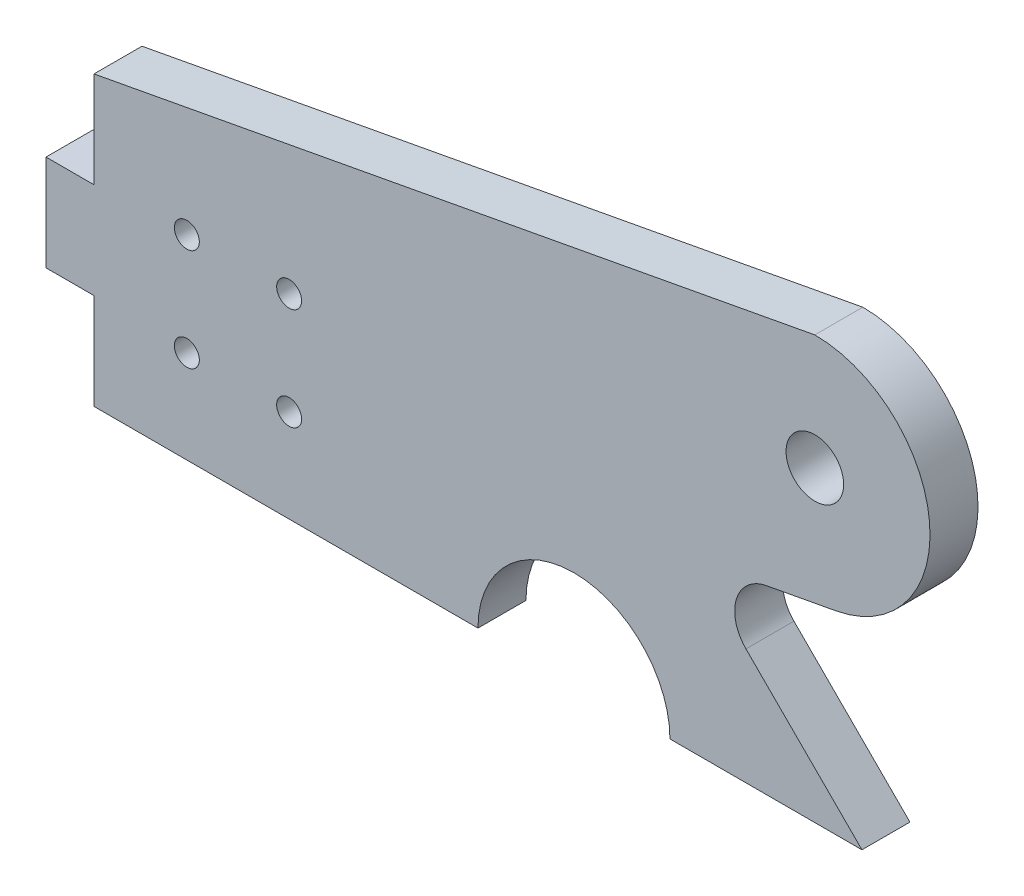
ISO-10303-21;
HEADER;
FILE_DESCRIPTION(('STEP AP214'),'2;1');
FILE_NAME('part.step','',(''),(''),'','','');
FILE_SCHEMA(('AUTOMOTIVE_DESIGN { 1 0 10303 214 1 1 1 1 }'));
ENDSEC;
DATA;
#1=APPLICATION_CONTEXT('core data for automotive mechanical design processes');
#2=APPLICATION_PROTOCOL_DEFINITION('international standard','automotive_design',2000,#1);
#3=PRODUCT_CONTEXT('',#1,'mechanical');
#4=PRODUCT('Part','Part','',(#3));
#5=PRODUCT_RELATED_PRODUCT_CATEGORY('part','',(#4));
#6=PRODUCT_DEFINITION_FORMATION('','',#4);
#7=PRODUCT_DEFINITION_CONTEXT('part definition',#1,'design');
#8=PRODUCT_DEFINITION('design','',#6,#7);
#9=PRODUCT_DEFINITION_SHAPE('','',#8);
#10=(LENGTH_UNIT() NAMED_UNIT(*) SI_UNIT(.MILLI.,.METRE.));
#11=(NAMED_UNIT(*) PLANE_ANGLE_UNIT() SI_UNIT($,.RADIAN.));
#12=(NAMED_UNIT(*) SI_UNIT($,.STERADIAN.) SOLID_ANGLE_UNIT());
#13=UNCERTAINTY_MEASURE_WITH_UNIT(LENGTH_MEASURE(1.E-05),#10,'distance_accuracy_value','');
#14=(GEOMETRIC_REPRESENTATION_CONTEXT(3) GLOBAL_UNCERTAINTY_ASSIGNED_CONTEXT((#13)) GLOBAL_UNIT_ASSIGNED_CONTEXT((#10,
#11,#12)) REPRESENTATION_CONTEXT('',''));
#15=CARTESIAN_POINT('',(0.,0.,0.));
#16=DIRECTION('',(0.,0.,1.));
#17=DIRECTION('',(1.,0.,0.));
#18=AXIS2_PLACEMENT_3D('',#15,#16,#17);
#19=CARTESIAN_POINT('',(0.,0.,6.35));
#20=DIRECTION('',(0.,1.,0.));
#21=DIRECTION('',(-1.,0.,0.));
#22=AXIS2_PLACEMENT_3D('',#19,#20,#21);
#23=PLANE('',#22);
#24=DIRECTION('',(1.,0.,0.));
#25=VECTOR('',#24,1.);
#26=CARTESIAN_POINT('',(0.,0.,0.));
#27=LINE('',#26,#25);
#28=CARTESIAN_POINT('',(0.,0.,0.));
#29=VERTEX_POINT('',#28);
#30=CARTESIAN_POINT('',(50.8,0.,0.));
#31=VERTEX_POINT('',#30);
#32=EDGE_CURVE('E143',#29,#31,#27,.T.);
#33=ORIENTED_EDGE('',*,*,#32,.T.);
#34=DIRECTION('',(0.,0.,1.));
#35=VECTOR('',#34,1.);
#36=CARTESIAN_POINT('',(50.8,0.,0.));
#37=LINE('',#36,#35);
#38=CARTESIAN_POINT('',(50.8,0.,6.35));
#39=VERTEX_POINT('',#38);
#40=EDGE_CURVE('E129',#31,#39,#37,.T.);
#41=ORIENTED_EDGE('',*,*,#40,.T.);
#42=DIRECTION('',(1.,0.,0.));
#43=VECTOR('',#42,1.);
#44=CARTESIAN_POINT('',(0.,0.,6.35));
#45=LINE('',#44,#43);
#46=CARTESIAN_POINT('',(0.,0.,6.35));
#47=VERTEX_POINT('',#46);
#48=EDGE_CURVE('E223',#47,#39,#45,.T.);
#49=ORIENTED_EDGE('',*,*,#48,.F.);
#50=DIRECTION('',(0.,0.,-1.));
#51=VECTOR('',#50,1.);
#52=CARTESIAN_POINT('',(0.,0.,6.35));
#53=LINE('',#52,#51);
#54=EDGE_CURVE('E149',#47,#29,#53,.T.);
#55=ORIENTED_EDGE('',*,*,#54,.T.);
#56=EDGE_LOOP('',(#33,#41,#49,#55));
#57=FACE_BOUND('',#56,.T.);
#58=ADVANCED_FACE('F35',(#57),#23,.F.);
#59=CARTESIAN_POINT('',(95.3674532925549,40.64,6.35));
#60=DIRECTION('',(0.,0.,1.));
#61=DIRECTION('',(1.,0.,0.));
#62=AXIS2_PLACEMENT_3D('',#59,#60,#61);
#63=PLANE('',#62);
#64=CARTESIAN_POINT('',(63.5,0.,6.35));
#65=DIRECTION('',(0.,0.,1.));
#66=DIRECTION('',(1.,0.,0.));
#67=AXIS2_PLACEMENT_3D('',#64,#65,#66);
#68=CIRCLE('',#67,12.7);
#69=CARTESIAN_POINT('',(76.2,0.,6.35));
#70=VERTEX_POINT('',#69);
#71=EDGE_CURVE('E132',#70,#39,#68,.T.);
#72=ORIENTED_EDGE('',*,*,#71,.F.);
#73=CARTESIAN_POINT('',(101.6,0.,6.35));
#74=VERTEX_POINT('',#73);
#75=EDGE_CURVE('E244',#70,#74,#45,.T.);
#76=ORIENTED_EDGE('',*,*,#75,.T.);
#77=DIRECTION('',(-0.707106781186551,0.707106781186544,0.));
#78=VECTOR('',#77,1.);
#79=CARTESIAN_POINT('',(101.6,0.,6.35));
#80=LINE('',#79,#78);
#81=CARTESIAN_POINT('',(86.2519913059842,15.3480086940156,6.35));
#82=VERTEX_POINT('',#81);
#83=EDGE_CURVE('E215',#74,#82,#80,.T.);
#84=ORIENTED_EDGE('',*,*,#83,.T.);
#85=CARTESIAN_POINT('',(89.8440937544119,18.9401111424433,6.35));
#86=DIRECTION('',(0.,0.,1.));
#87=DIRECTION('',(1.,0.,0.));
#88=AXIS2_PLACEMENT_3D('',#85,#86,#87);
#89=CIRCLE('',#88,5.08);
#90=CARTESIAN_POINT('',(88.913037875358,23.934060977001,6.35));
#91=VERTEX_POINT('',#90);
#92=EDGE_CURVE('E11',#82,#91,#89,.F.);
#93=ORIENTED_EDGE('',*,*,#92,.T.);
#94=DIRECTION('',(0.983060991054671,0.183278716349196,0.));
#95=VECTOR('',#94,1.);
#96=CARTESIAN_POINT('',(79.4333090501251,22.1666909498746,6.35));
#97=LINE('',#96,#95);
#98=CARTESIAN_POINT('',(98.1606209297166,25.6581504963268,6.35));
#99=VERTEX_POINT('',#98);
#100=EDGE_CURVE('E213',#91,#99,#97,.T.);
#101=ORIENTED_EDGE('',*,*,#100,.T.);
#102=CARTESIAN_POINT('',(95.3674532925549,40.64,6.35));
#103=DIRECTION('',(0.,0.,1.));
#104=DIRECTION('',(1.,0.,0.));
#105=AXIS2_PLACEMENT_3D('',#102,#103,#104);
#106=CIRCLE('',#105,15.24);
#107=CARTESIAN_POINT('',(95.3674532925549,55.88,6.35));
#108=VERTEX_POINT('',#107);
#109=EDGE_CURVE('E219',#99,#108,#106,.T.);
#110=ORIENTED_EDGE('',*,*,#109,.T.);
#111=DIRECTION('',(-0.983060991054669,-0.183278716349203,0.));
#112=VECTOR('',#111,1.);
#113=CARTESIAN_POINT('',(95.3674532925549,55.88,6.35));
#114=LINE('',#113,#112);
#115=CARTESIAN_POINT('',(0.,38.1,6.35));
#116=VERTEX_POINT('',#115);
#117=EDGE_CURVE('E221',#108,#116,#114,.T.);
#118=ORIENTED_EDGE('',*,*,#117,.T.);
#119=DIRECTION('',(0.,-1.,0.));
#120=VECTOR('',#119,1.);
#121=CARTESIAN_POINT('',(0.,38.1,6.35));
#122=LINE('',#121,#120);
#123=CARTESIAN_POINT('',(0.,25.4,6.35));
#124=VERTEX_POINT('',#123);
#125=EDGE_CURVE('E228',#116,#124,#122,.T.);
#126=ORIENTED_EDGE('',*,*,#125,.T.);
#127=DIRECTION('',(-1.,0.,0.));
#128=VECTOR('',#127,1.);
#129=CARTESIAN_POINT('',(0.,25.4,6.35));
#130=LINE('',#129,#128);
#131=CARTESIAN_POINT('',(-6.35,25.4,6.35));
#132=VERTEX_POINT('',#131);
#133=EDGE_CURVE('E230',#124,#132,#130,.T.);
#134=ORIENTED_EDGE('',*,*,#133,.T.);
#135=DIRECTION('',(0.,-1.,0.));
#136=VECTOR('',#135,1.);
#137=CARTESIAN_POINT('',(-6.35,25.4,6.35));
#138=LINE('',#137,#136);
#139=CARTESIAN_POINT('',(-6.35,12.7,6.35));
#140=VERTEX_POINT('',#139);
#141=EDGE_CURVE('E232',#132,#140,#138,.T.);
#142=ORIENTED_EDGE('',*,*,#141,.T.);
#143=DIRECTION('',(1.,0.,0.));
#144=VECTOR('',#143,1.);
#145=CARTESIAN_POINT('',(0.,12.7,6.35));
#146=LINE('',#145,#144);
#147=CARTESIAN_POINT('',(0.,12.7,6.35));
#148=VERTEX_POINT('',#147);
#149=EDGE_CURVE('E177',#140,#148,#146,.T.);
#150=ORIENTED_EDGE('',*,*,#149,.T.);
#151=DIRECTION('',(0.,-1.,0.));
#152=VECTOR('',#151,1.);
#153=CARTESIAN_POINT('',(0.,12.7,6.35));
#154=LINE('',#153,#152);
#155=EDGE_CURVE('E172',#148,#47,#154,.T.);
#156=ORIENTED_EDGE('',*,*,#155,.T.);
#157=ORIENTED_EDGE('',*,*,#48,.T.);
#158=EDGE_LOOP('',(#72,#76,#84,#93,#101,#110,#118,#126,#134,#142,#150,#156,#157));
#159=FACE_BOUND('',#158,.T.);
#160=CARTESIAN_POINT('',(12.2829881040447,12.2829881040447,6.35));
#161=DIRECTION('',(0.,0.,1.));
#162=DIRECTION('',(1.,0.,0.));
#163=AXIS2_PLACEMENT_3D('',#160,#161,#162);
#164=CIRCLE('',#163,1.65099999999998);
#165=CARTESIAN_POINT('',(13.9339881040447,12.2829881040447,6.35));
#166=VERTEX_POINT('',#165);
#167=EDGE_CURVE('E274',#166,#166,#164,.T.);
#168=ORIENTED_EDGE('',*,*,#167,.F.);
#169=EDGE_LOOP('',(#168));
#170=FACE_BOUND('',#169,.T.);
#171=CARTESIAN_POINT('',(25.8170118959553,25.8170118959552,6.35));
#172=DIRECTION('',(0.,0.,1.));
#173=DIRECTION('',(1.,0.,0.));
#174=AXIS2_PLACEMENT_3D('',#171,#172,#173);
#175=CIRCLE('',#174,1.65099999999998);
#176=CARTESIAN_POINT('',(27.4680118959552,25.8170118959552,6.35));
#177=VERTEX_POINT('',#176);
#178=EDGE_CURVE('E286',#177,#177,#175,.T.);
#179=ORIENTED_EDGE('',*,*,#178,.F.);
#180=EDGE_LOOP('',(#179));
#181=FACE_BOUND('',#180,.T.);
#182=CARTESIAN_POINT('',(95.3674532925549,40.64,6.35));
#183=DIRECTION('',(0.,0.,1.));
#184=DIRECTION('',(1.,0.,0.));
#185=AXIS2_PLACEMENT_3D('',#182,#183,#184);
#186=CIRCLE('',#185,3.81000000000002);
#187=CARTESIAN_POINT('',(99.1774532925549,40.64,6.35));
#188=VERTEX_POINT('',#187);
#189=EDGE_CURVE('E290',#188,#188,#186,.T.);
#190=ORIENTED_EDGE('',*,*,#189,.F.);
#191=EDGE_LOOP('',(#190));
#192=FACE_BOUND('',#191,.T.);
#193=CARTESIAN_POINT('',(25.8170118959553,12.2829881040447,6.35));
#194=DIRECTION('',(0.,0.,1.));
#195=DIRECTION('',(1.,0.,0.));
#196=AXIS2_PLACEMENT_3D('',#193,#194,#195);
#197=CIRCLE('',#196,1.65099999999998);
#198=CARTESIAN_POINT('',(27.4680118959552,12.2829881040447,6.35));
#199=VERTEX_POINT('',#198);
#200=EDGE_CURVE('E280',#199,#199,#197,.T.);
#201=ORIENTED_EDGE('',*,*,#200,.F.);
#202=EDGE_LOOP('',(#201));
#203=FACE_BOUND('',#202,.T.);
#204=CARTESIAN_POINT('',(12.2829881040448,25.8170118959553,6.35));
#205=DIRECTION('',(0.,0.,1.));
#206=DIRECTION('',(1.,0.,0.));
#207=AXIS2_PLACEMENT_3D('',#204,#205,#206);
#208=CIRCLE('',#207,1.65099999999999);
#209=CARTESIAN_POINT('',(13.9339881040447,25.8170118959553,6.35));
#210=VERTEX_POINT('',#209);
#211=EDGE_CURVE('E268',#210,#210,#208,.T.);
#212=ORIENTED_EDGE('',*,*,#211,.F.);
#213=EDGE_LOOP('',(#212));
#214=FACE_BOUND('',#213,.T.);
#215=ADVANCED_FACE('F211',(#159,#170,#181,#192,#203,#214),#63,.T.);
#216=CARTESIAN_POINT('',(95.3674532925549,40.64,0.));
#217=DIRECTION('',(0.,0.,1.));
#218=DIRECTION('',(1.,0.,0.));
#219=AXIS2_PLACEMENT_3D('',#216,#217,#218);
#220=PLANE('',#219);
#221=CARTESIAN_POINT('',(76.2,0.,0.));
#222=VERTEX_POINT('',#221);
#223=CARTESIAN_POINT('',(101.6,0.,0.));
#224=VERTEX_POINT('',#223);
#225=EDGE_CURVE('E146',#222,#224,#27,.T.);
#226=ORIENTED_EDGE('',*,*,#225,.F.);
#227=CARTESIAN_POINT('',(63.5,0.,0.));
#228=DIRECTION('',(0.,0.,1.));
#229=DIRECTION('',(1.,0.,0.));
#230=AXIS2_PLACEMENT_3D('',#227,#228,#229);
#231=CIRCLE('',#230,12.7);
#232=EDGE_CURVE('E50',#222,#31,#231,.T.);
#233=ORIENTED_EDGE('',*,*,#232,.T.);
#234=ORIENTED_EDGE('',*,*,#32,.F.);
#235=DIRECTION('',(0.,-1.,0.));
#236=VECTOR('',#235,1.);
#237=CARTESIAN_POINT('',(0.,12.7,0.));
#238=LINE('',#237,#236);
#239=CARTESIAN_POINT('',(0.,12.7,0.));
#240=VERTEX_POINT('',#239);
#241=EDGE_CURVE('E155',#240,#29,#238,.T.);
#242=ORIENTED_EDGE('',*,*,#241,.F.);
#243=DIRECTION('',(1.,0.,0.));
#244=VECTOR('',#243,1.);
#245=CARTESIAN_POINT('',(0.,12.7,0.));
#246=LINE('',#245,#244);
#247=CARTESIAN_POINT('',(-6.35,12.7,0.));
#248=VERTEX_POINT('',#247);
#249=EDGE_CURVE('E170',#248,#240,#246,.T.);
#250=ORIENTED_EDGE('',*,*,#249,.F.);
#251=DIRECTION('',(0.,-1.,0.));
#252=VECTOR('',#251,1.);
#253=CARTESIAN_POINT('',(-6.35,25.4,0.));
#254=LINE('',#253,#252);
#255=CARTESIAN_POINT('',(-6.35,25.4,0.));
#256=VERTEX_POINT('',#255);
#257=EDGE_CURVE('E168',#256,#248,#254,.T.);
#258=ORIENTED_EDGE('',*,*,#257,.F.);
#259=DIRECTION('',(-1.,0.,0.));
#260=VECTOR('',#259,1.);
#261=CARTESIAN_POINT('',(0.,25.4,0.));
#262=LINE('',#261,#260);
#263=CARTESIAN_POINT('',(0.,25.4,0.));
#264=VERTEX_POINT('',#263);
#265=EDGE_CURVE('E166',#264,#256,#262,.T.);
#266=ORIENTED_EDGE('',*,*,#265,.F.);
#267=DIRECTION('',(0.,-1.,0.));
#268=VECTOR('',#267,1.);
#269=CARTESIAN_POINT('',(0.,38.1,0.));
#270=LINE('',#269,#268);
#271=CARTESIAN_POINT('',(0.,38.1,0.));
#272=VERTEX_POINT('',#271);
#273=EDGE_CURVE('E164',#272,#264,#270,.T.);
#274=ORIENTED_EDGE('',*,*,#273,.F.);
#275=DIRECTION('',(-0.983060991054669,-0.183278716349203,0.));
#276=VECTOR('',#275,1.);
#277=CARTESIAN_POINT('',(95.3674532925549,55.88,0.));
#278=LINE('',#277,#276);
#279=CARTESIAN_POINT('',(95.3674532925549,55.88,0.));
#280=VERTEX_POINT('',#279);
#281=EDGE_CURVE('E162',#280,#272,#278,.T.);
#282=ORIENTED_EDGE('',*,*,#281,.F.);
#283=CARTESIAN_POINT('',(95.3674532925549,40.64,0.));
#284=DIRECTION('',(0.,0.,1.));
#285=DIRECTION('',(1.,0.,0.));
#286=AXIS2_PLACEMENT_3D('',#283,#284,#285);
#287=CIRCLE('',#286,15.24);
#288=CARTESIAN_POINT('',(98.1606209297166,25.6581504963268,0.));
#289=VERTEX_POINT('',#288);
#290=EDGE_CURVE('E160',#289,#280,#287,.T.);
#291=ORIENTED_EDGE('',*,*,#290,.F.);
#292=DIRECTION('',(0.983060991054671,0.183278716349196,0.));
#293=VECTOR('',#292,1.);
#294=CARTESIAN_POINT('',(79.4333090501251,22.1666909498746,0.));
#295=LINE('',#294,#293);
#296=CARTESIAN_POINT('',(88.913037875358,23.934060977001,0.));
#297=VERTEX_POINT('',#296);
#298=EDGE_CURVE('E153',#297,#289,#295,.T.);
#299=ORIENTED_EDGE('',*,*,#298,.F.);
#300=CARTESIAN_POINT('',(89.8440937544119,18.9401111424433,0.));
#301=DIRECTION('',(0.,0.,1.));
#302=DIRECTION('',(1.,0.,0.));
#303=AXIS2_PLACEMENT_3D('',#300,#301,#302);
#304=CIRCLE('',#303,5.08);
#305=CARTESIAN_POINT('',(86.2519913059842,15.3480086940156,0.));
#306=VERTEX_POINT('',#305);
#307=EDGE_CURVE('E43',#297,#306,#304,.T.);
#308=ORIENTED_EDGE('',*,*,#307,.T.);
#309=DIRECTION('',(-0.707106781186551,0.707106781186544,0.));
#310=VECTOR('',#309,1.);
#311=CARTESIAN_POINT('',(101.6,0.,0.));
#312=LINE('',#311,#310);
#313=EDGE_CURVE('E151',#224,#306,#312,.T.);
#314=ORIENTED_EDGE('',*,*,#313,.F.);
#315=EDGE_LOOP('',(#226,#233,#234,#242,#250,#258,#266,#274,#282,#291,#299,#308,#314));
#316=FACE_BOUND('',#315,.T.);
#317=CARTESIAN_POINT('',(95.3674532925549,40.64,0.));
#318=DIRECTION('',(0.,0.,1.));
#319=DIRECTION('',(1.,0.,0.));
#320=AXIS2_PLACEMENT_3D('',#317,#318,#319);
#321=CIRCLE('',#320,3.81000000000002);
#322=CARTESIAN_POINT('',(99.1774532925549,40.64,0.));
#323=VERTEX_POINT('',#322);
#324=EDGE_CURVE('E247',#323,#323,#321,.T.);
#325=ORIENTED_EDGE('',*,*,#324,.T.);
#326=EDGE_LOOP('',(#325));
#327=FACE_BOUND('',#326,.T.);
#328=CARTESIAN_POINT('',(25.8170118959553,25.8170118959552,0.));
#329=DIRECTION('',(0.,0.,1.));
#330=DIRECTION('',(1.,0.,0.));
#331=AXIS2_PLACEMENT_3D('',#328,#329,#330);
#332=CIRCLE('',#331,1.65099999999998);
#333=CARTESIAN_POINT('',(27.4680118959552,25.8170118959552,0.));
#334=VERTEX_POINT('',#333);
#335=EDGE_CURVE('E283',#334,#334,#332,.T.);
#336=ORIENTED_EDGE('',*,*,#335,.T.);
#337=EDGE_LOOP('',(#336));
#338=FACE_BOUND('',#337,.T.);
#339=CARTESIAN_POINT('',(25.8170118959553,12.2829881040447,0.));
#340=DIRECTION('',(0.,0.,1.));
#341=DIRECTION('',(1.,0.,0.));
#342=AXIS2_PLACEMENT_3D('',#339,#340,#341);
#343=CIRCLE('',#342,1.65099999999998);
#344=CARTESIAN_POINT('',(27.4680118959552,12.2829881040447,0.));
#345=VERTEX_POINT('',#344);
#346=EDGE_CURVE('E277',#345,#345,#343,.T.);
#347=ORIENTED_EDGE('',*,*,#346,.T.);
#348=EDGE_LOOP('',(#347));
#349=FACE_BOUND('',#348,.T.);
#350=CARTESIAN_POINT('',(12.2829881040447,12.2829881040447,0.));
#351=DIRECTION('',(0.,0.,1.));
#352=DIRECTION('',(1.,0.,0.));
#353=AXIS2_PLACEMENT_3D('',#350,#351,#352);
#354=CIRCLE('',#353,1.65099999999998);
#355=CARTESIAN_POINT('',(13.9339881040447,12.2829881040447,0.));
#356=VERTEX_POINT('',#355);
#357=EDGE_CURVE('E271',#356,#356,#354,.T.);
#358=ORIENTED_EDGE('',*,*,#357,.T.);
#359=EDGE_LOOP('',(#358));
#360=FACE_BOUND('',#359,.T.);
#361=CARTESIAN_POINT('',(12.2829881040448,25.8170118959553,0.));
#362=DIRECTION('',(0.,0.,1.));
#363=DIRECTION('',(1.,0.,0.));
#364=AXIS2_PLACEMENT_3D('',#361,#362,#363);
#365=CIRCLE('',#364,1.65099999999999);
#366=CARTESIAN_POINT('',(13.9339881040447,25.8170118959553,0.));
#367=VERTEX_POINT('',#366);
#368=EDGE_CURVE('E262',#367,#367,#365,.T.);
#369=ORIENTED_EDGE('',*,*,#368,.T.);
#370=EDGE_LOOP('',(#369));
#371=FACE_BOUND('',#370,.T.);
#372=ADVANCED_FACE('F140',(#316,#327,#338,#349,#360,#371),#220,.F.);
#373=CARTESIAN_POINT('',(0.,12.7,6.35));
#374=DIRECTION('',(1.,0.,0.));
#375=DIRECTION('',(0.,1.,0.));
#376=AXIS2_PLACEMENT_3D('',#373,#374,#375);
#377=PLANE('',#376);
#378=CARTESIAN_POINT('',(0.,6.35,3.175));
#379=DIRECTION('',(-1.,0.,0.));
#380=DIRECTION('',(0.,-1.,0.));
#381=AXIS2_PLACEMENT_3D('',#378,#379,#380);
#382=CIRCLE('',#381,1.5875);
#383=CARTESIAN_POINT('',(0.,4.7625,3.175));
#384=VERTEX_POINT('',#383);
#385=EDGE_CURVE('E253',#384,#384,#382,.T.);
#386=ORIENTED_EDGE('',*,*,#385,.F.);
#387=EDGE_LOOP('',(#386));
#388=FACE_BOUND('',#387,.T.);
#389=ORIENTED_EDGE('',*,*,#241,.T.);
#390=ORIENTED_EDGE('',*,*,#54,.F.);
#391=ORIENTED_EDGE('',*,*,#155,.F.);
#392=DIRECTION('',(0.,0.,-1.));
#393=VECTOR('',#392,1.);
#394=CARTESIAN_POINT('',(0.,12.7,6.35));
#395=LINE('',#394,#393);
#396=EDGE_CURVE('E173',#148,#240,#395,.T.);
#397=ORIENTED_EDGE('',*,*,#396,.T.);
#398=EDGE_LOOP('',(#389,#390,#391,#397));
#399=FACE_BOUND('',#398,.T.);
#400=ADVANCED_FACE('F243',(#388,#399),#377,.F.);
#401=ORIENTED_EDGE('',*,*,#75,.F.);
#402=DIRECTION('',(0.,0.,1.));
#403=VECTOR('',#402,1.);
#404=CARTESIAN_POINT('',(76.2,0.,0.));
#405=LINE('',#404,#403);
#406=EDGE_CURVE('E136',#222,#70,#405,.T.);
#407=ORIENTED_EDGE('',*,*,#406,.F.);
#408=ORIENTED_EDGE('',*,*,#225,.T.);
#409=DIRECTION('',(0.,0.,-1.));
#410=VECTOR('',#409,1.);
#411=CARTESIAN_POINT('',(101.6,0.,6.35));
#412=LINE('',#411,#410);
#413=EDGE_CURVE('E195',#74,#224,#412,.T.);
#414=ORIENTED_EDGE('',*,*,#413,.F.);
#415=EDGE_LOOP('',(#401,#407,#408,#414));
#416=FACE_BOUND('',#415,.T.);
#417=ADVANCED_FACE('F252',(#416),#23,.F.);
#418=CARTESIAN_POINT('',(101.6,0.,6.35));
#419=DIRECTION('',(-0.707106781186544,-0.707106781186551,0.));
#420=DIRECTION('',(0.707106781186551,-0.707106781186544,0.));
#421=AXIS2_PLACEMENT_3D('',#418,#419,#420);
#422=PLANE('',#421);
#423=ORIENTED_EDGE('',*,*,#313,.T.);
#424=DIRECTION('',(0.,0.,-1.));
#425=VECTOR('',#424,1.);
#426=CARTESIAN_POINT('',(86.2519913059842,15.3480086940156,6.35));
#427=LINE('',#426,#425);
#428=EDGE_CURVE('E58',#306,#82,#427,.F.);
#429=ORIENTED_EDGE('',*,*,#428,.T.);
#430=ORIENTED_EDGE('',*,*,#83,.F.);
#431=ORIENTED_EDGE('',*,*,#413,.T.);
#432=EDGE_LOOP('',(#423,#429,#430,#431));
#433=FACE_BOUND('',#432,.T.);
#434=ADVANCED_FACE('F206',(#433),#422,.F.);
#435=CARTESIAN_POINT('',(79.4333090501251,22.1666909498746,6.35));
#436=DIRECTION('',(-0.183278716349196,0.98306099105467,0.));
#437=DIRECTION('',(-0.98306099105467,-0.183278716349196,0.));
#438=AXIS2_PLACEMENT_3D('',#435,#436,#437);
#439=PLANE('',#438);
#440=ORIENTED_EDGE('',*,*,#100,.F.);
#441=DIRECTION('',(0.,0.,-1.));
#442=VECTOR('',#441,1.);
#443=CARTESIAN_POINT('',(88.913037875358,23.934060977001,0.));
#444=LINE('',#443,#442);
#445=EDGE_CURVE('E199',#91,#297,#444,.T.);
#446=ORIENTED_EDGE('',*,*,#445,.T.);
#447=ORIENTED_EDGE('',*,*,#298,.T.);
#448=DIRECTION('',(0.,0.,-1.));
#449=VECTOR('',#448,1.);
#450=CARTESIAN_POINT('',(98.1606209297166,25.6581504963268,6.35));
#451=LINE('',#450,#449);
#452=EDGE_CURVE('E192',#99,#289,#451,.T.);
#453=ORIENTED_EDGE('',*,*,#452,.F.);
#454=EDGE_LOOP('',(#440,#446,#447,#453));
#455=FACE_BOUND('',#454,.T.);
#456=ADVANCED_FACE('F217',(#455),#439,.F.);
#457=CARTESIAN_POINT('',(95.3674532925549,40.64,6.35));
#458=DIRECTION('',(0.,0.,-1.));
#459=DIRECTION('',(-1.,0.,0.));
#460=AXIS2_PLACEMENT_3D('',#457,#458,#459);
#461=CYLINDRICAL_SURFACE('',#460,15.24);
#462=ORIENTED_EDGE('',*,*,#290,.T.);
#463=DIRECTION('',(0.,0.,-1.));
#464=VECTOR('',#463,1.);
#465=CARTESIAN_POINT('',(95.3674532925549,55.88,6.35));
#466=LINE('',#465,#464);
#467=EDGE_CURVE('E189',#108,#280,#466,.T.);
#468=ORIENTED_EDGE('',*,*,#467,.F.);
#469=ORIENTED_EDGE('',*,*,#109,.F.);
#470=ORIENTED_EDGE('',*,*,#452,.T.);
#471=EDGE_LOOP('',(#462,#468,#469,#470));
#472=FACE_BOUND('',#471,.T.);
#473=ADVANCED_FACE('F455',(#472),#461,.T.);
#474=CARTESIAN_POINT('',(95.3674532925549,55.88,6.35));
#475=DIRECTION('',(0.183278716349203,-0.983060991054669,0.));
#476=DIRECTION('',(0.983060991054669,0.183278716349203,0.));
#477=AXIS2_PLACEMENT_3D('',#474,#475,#476);
#478=PLANE('',#477);
#479=ORIENTED_EDGE('',*,*,#281,.T.);
#480=DIRECTION('',(0.,0.,-1.));
#481=VECTOR('',#480,1.);
#482=CARTESIAN_POINT('',(0.,38.1,6.35));
#483=LINE('',#482,#481);
#484=EDGE_CURVE('E186',#116,#272,#483,.T.);
#485=ORIENTED_EDGE('',*,*,#484,.F.);
#486=ORIENTED_EDGE('',*,*,#117,.F.);
#487=ORIENTED_EDGE('',*,*,#467,.T.);
#488=EDGE_LOOP('',(#479,#485,#486,#487));
#489=FACE_BOUND('',#488,.T.);
#490=ADVANCED_FACE('F463',(#489),#478,.F.);
#491=CARTESIAN_POINT('',(0.,38.1,6.35));
#492=DIRECTION('',(1.,0.,0.));
#493=DIRECTION('',(0.,1.,0.));
#494=AXIS2_PLACEMENT_3D('',#491,#492,#493);
#495=PLANE('',#494);
#496=CARTESIAN_POINT('',(0.,31.75,3.175));
#497=DIRECTION('',(-1.,0.,0.));
#498=DIRECTION('',(0.,-1.,0.));
#499=AXIS2_PLACEMENT_3D('',#496,#497,#498);
#500=CIRCLE('',#499,1.5875);
#501=CARTESIAN_POINT('',(0.,30.1625,3.175));
#502=VERTEX_POINT('',#501);
#503=EDGE_CURVE('E263',#502,#502,#500,.T.);
#504=ORIENTED_EDGE('',*,*,#503,.F.);
#505=EDGE_LOOP('',(#504));
#506=FACE_BOUND('',#505,.T.);
#507=ORIENTED_EDGE('',*,*,#273,.T.);
#508=DIRECTION('',(0.,0.,-1.));
#509=VECTOR('',#508,1.);
#510=CARTESIAN_POINT('',(0.,25.4,6.35));
#511=LINE('',#510,#509);
#512=EDGE_CURVE('E183',#124,#264,#511,.T.);
#513=ORIENTED_EDGE('',*,*,#512,.F.);
#514=ORIENTED_EDGE('',*,*,#125,.F.);
#515=ORIENTED_EDGE('',*,*,#484,.T.);
#516=EDGE_LOOP('',(#507,#513,#514,#515));
#517=FACE_BOUND('',#516,.T.);
#518=ADVANCED_FACE('F472',(#506,#517),#495,.F.);
#519=CARTESIAN_POINT('',(0.,25.4,6.35));
#520=DIRECTION('',(0.,-1.,0.));
#521=DIRECTION('',(0.,0.,-1.));
#522=AXIS2_PLACEMENT_3D('',#519,#520,#521);
#523=PLANE('',#522);
#524=ORIENTED_EDGE('',*,*,#265,.T.);
#525=DIRECTION('',(0.,0.,-1.));
#526=VECTOR('',#525,1.);
#527=CARTESIAN_POINT('',(-6.35,25.4,6.35));
#528=LINE('',#527,#526);
#529=EDGE_CURVE('E180',#132,#256,#528,.T.);
#530=ORIENTED_EDGE('',*,*,#529,.F.);
#531=ORIENTED_EDGE('',*,*,#133,.F.);
#532=ORIENTED_EDGE('',*,*,#512,.T.);
#533=EDGE_LOOP('',(#524,#530,#531,#532));
#534=FACE_BOUND('',#533,.T.);
#535=ADVANCED_FACE('F481',(#534),#523,.F.);
#536=CARTESIAN_POINT('',(-6.35,25.4,6.35));
#537=DIRECTION('',(1.,0.,0.));
#538=DIRECTION('',(0.,1.,0.));
#539=AXIS2_PLACEMENT_3D('',#536,#537,#538);
#540=PLANE('',#539);
#541=ORIENTED_EDGE('',*,*,#257,.T.);
#542=DIRECTION('',(0.,0.,-1.));
#543=VECTOR('',#542,1.);
#544=CARTESIAN_POINT('',(-6.35,12.7,6.35));
#545=LINE('',#544,#543);
#546=EDGE_CURVE('E176',#140,#248,#545,.T.);
#547=ORIENTED_EDGE('',*,*,#546,.F.);
#548=ORIENTED_EDGE('',*,*,#141,.F.);
#549=ORIENTED_EDGE('',*,*,#529,.T.);
#550=EDGE_LOOP('',(#541,#547,#548,#549));
#551=FACE_BOUND('',#550,.T.);
#552=ADVANCED_FACE('F309',(#551),#540,.F.);
#553=CARTESIAN_POINT('',(0.,12.7,6.35));
#554=DIRECTION('',(0.,1.,0.));
#555=DIRECTION('',(0.,0.,1.));
#556=AXIS2_PLACEMENT_3D('',#553,#554,#555);
#557=PLANE('',#556);
#558=ORIENTED_EDGE('',*,*,#249,.T.);
#559=ORIENTED_EDGE('',*,*,#396,.F.);
#560=ORIENTED_EDGE('',*,*,#149,.F.);
#561=ORIENTED_EDGE('',*,*,#546,.T.);
#562=EDGE_LOOP('',(#558,#559,#560,#561));
#563=FACE_BOUND('',#562,.T.);
#564=ADVANCED_FACE('F240',(#563),#557,.F.);
#565=CARTESIAN_POINT('',(95.3674532925549,40.64,6.35));
#566=DIRECTION('',(0.,0.,-1.));
#567=DIRECTION('',(-1.,0.,0.));
#568=AXIS2_PLACEMENT_3D('',#565,#566,#567);
#569=CYLINDRICAL_SURFACE('',#568,3.81000000000002);
#570=ORIENTED_EDGE('',*,*,#189,.T.);
#571=EDGE_LOOP('',(#570));
#572=FACE_BOUND('',#571,.T.);
#573=ORIENTED_EDGE('',*,*,#324,.F.);
#574=EDGE_LOOP('',(#573));
#575=FACE_BOUND('',#574,.T.);
#576=ADVANCED_FACE('F298',(#572,#575),#569,.F.);
#577=CARTESIAN_POINT('',(25.8170118959553,25.8170118959552,6.35));
#578=DIRECTION('',(0.,0.,-1.));
#579=DIRECTION('',(-1.,0.,0.));
#580=AXIS2_PLACEMENT_3D('',#577,#578,#579);
#581=CYLINDRICAL_SURFACE('',#580,1.65099999999998);
#582=ORIENTED_EDGE('',*,*,#178,.T.);
#583=EDGE_LOOP('',(#582));
#584=FACE_BOUND('',#583,.T.);
#585=ORIENTED_EDGE('',*,*,#335,.F.);
#586=EDGE_LOOP('',(#585));
#587=FACE_BOUND('',#586,.T.);
#588=ADVANCED_FACE('F300',(#584,#587),#581,.F.);
#589=CARTESIAN_POINT('',(25.8170118959553,12.2829881040447,6.35));
#590=DIRECTION('',(0.,0.,-1.));
#591=DIRECTION('',(-1.,0.,0.));
#592=AXIS2_PLACEMENT_3D('',#589,#590,#591);
#593=CYLINDRICAL_SURFACE('',#592,1.65099999999998);
#594=ORIENTED_EDGE('',*,*,#200,.T.);
#595=EDGE_LOOP('',(#594));
#596=FACE_BOUND('',#595,.T.);
#597=ORIENTED_EDGE('',*,*,#346,.F.);
#598=EDGE_LOOP('',(#597));
#599=FACE_BOUND('',#598,.T.);
#600=ADVANCED_FACE('F306',(#596,#599),#593,.F.);
#601=CARTESIAN_POINT('',(12.2829881040447,12.2829881040447,6.35));
#602=DIRECTION('',(0.,0.,-1.));
#603=DIRECTION('',(-1.,0.,0.));
#604=AXIS2_PLACEMENT_3D('',#601,#602,#603);
#605=CYLINDRICAL_SURFACE('',#604,1.65099999999998);
#606=ORIENTED_EDGE('',*,*,#167,.T.);
#607=EDGE_LOOP('',(#606));
#608=FACE_BOUND('',#607,.T.);
#609=ORIENTED_EDGE('',*,*,#357,.F.);
#610=EDGE_LOOP('',(#609));
#611=FACE_BOUND('',#610,.T.);
#612=ADVANCED_FACE('F351',(#608,#611),#605,.F.);
#613=CARTESIAN_POINT('',(12.2829881040448,25.8170118959553,6.35));
#614=DIRECTION('',(0.,0.,-1.));
#615=DIRECTION('',(-1.,0.,0.));
#616=AXIS2_PLACEMENT_3D('',#613,#614,#615);
#617=CYLINDRICAL_SURFACE('',#616,1.65099999999999);
#618=ORIENTED_EDGE('',*,*,#211,.T.);
#619=EDGE_LOOP('',(#618));
#620=FACE_BOUND('',#619,.T.);
#621=ORIENTED_EDGE('',*,*,#368,.F.);
#622=EDGE_LOOP('',(#621));
#623=FACE_BOUND('',#622,.T.);
#624=ADVANCED_FACE('F348',(#620,#623),#617,.F.);
#625=CARTESIAN_POINT('',(89.8440937544119,18.9401111424433,6.35));
#626=DIRECTION('',(0.,0.,1.));
#627=DIRECTION('',(1.,0.,0.));
#628=AXIS2_PLACEMENT_3D('',#625,#626,#627);
#629=CYLINDRICAL_SURFACE('',#628,5.08);
#630=ORIENTED_EDGE('',*,*,#92,.F.);
#631=ORIENTED_EDGE('',*,*,#428,.F.);
#632=ORIENTED_EDGE('',*,*,#307,.F.);
#633=ORIENTED_EDGE('',*,*,#445,.F.);
#634=EDGE_LOOP('',(#630,#631,#632,#633));
#635=FACE_BOUND('',#634,.T.);
#636=ADVANCED_FACE('F37',(#635),#629,.F.);
#637=CARTESIAN_POINT('',(6.34999999999999,31.75,3.175));
#638=DIRECTION('',(-1.,0.,0.));
#639=DIRECTION('',(0.,-1.,0.));
#640=AXIS2_PLACEMENT_3D('',#637,#638,#639);
#641=CYLINDRICAL_SURFACE('',#640,1.5875);
#642=CARTESIAN_POINT('',(6.34999999999999,31.75,3.175));
#643=DIRECTION('',(-1.,0.,0.));
#644=DIRECTION('',(0.,-1.,0.));
#645=AXIS2_PLACEMENT_3D('',#642,#643,#644);
#646=CIRCLE('',#645,1.5875);
#647=CARTESIAN_POINT('',(6.34999999999999,30.1625,3.175));
#648=VERTEX_POINT('',#647);
#649=EDGE_CURVE('E259',#648,#648,#646,.T.);
#650=ORIENTED_EDGE('',*,*,#649,.F.);
#651=EDGE_LOOP('',(#650));
#652=FACE_BOUND('',#651,.T.);
#653=ORIENTED_EDGE('',*,*,#503,.T.);
#654=EDGE_LOOP('',(#653));
#655=FACE_BOUND('',#654,.T.);
#656=ADVANCED_FACE('F342',(#652,#655),#641,.F.);
#657=CARTESIAN_POINT('',(6.34999999999999,31.75,3.175));
#658=DIRECTION('',(-1.,0.,0.));
#659=DIRECTION('',(0.,-1.,0.));
#660=AXIS2_PLACEMENT_3D('',#657,#658,#659);
#661=PLANE('',#660);
#662=ORIENTED_EDGE('',*,*,#649,.T.);
#663=EDGE_LOOP('',(#662));
#664=FACE_BOUND('',#663,.T.);
#665=ADVANCED_FACE('F333',(#664),#661,.T.);
#666=CARTESIAN_POINT('',(6.35,6.35,3.175));
#667=DIRECTION('',(-1.,0.,0.));
#668=DIRECTION('',(0.,-1.,0.));
#669=AXIS2_PLACEMENT_3D('',#666,#667,#668);
#670=CYLINDRICAL_SURFACE('',#669,1.5875);
#671=CARTESIAN_POINT('',(6.35,6.35,3.175));
#672=DIRECTION('',(-1.,0.,0.));
#673=DIRECTION('',(0.,-1.,0.));
#674=AXIS2_PLACEMENT_3D('',#671,#672,#673);
#675=CIRCLE('',#674,1.5875);
#676=CARTESIAN_POINT('',(6.35,4.7625,3.175));
#677=VERTEX_POINT('',#676);
#678=EDGE_CURVE('E256',#677,#677,#675,.T.);
#679=ORIENTED_EDGE('',*,*,#678,.F.);
#680=EDGE_LOOP('',(#679));
#681=FACE_BOUND('',#680,.T.);
#682=ORIENTED_EDGE('',*,*,#385,.T.);
#683=EDGE_LOOP('',(#682));
#684=FACE_BOUND('',#683,.T.);
#685=ADVANCED_FACE('F330',(#681,#684),#670,.F.);
#686=CARTESIAN_POINT('',(6.35,6.35,3.175));
#687=DIRECTION('',(-1.,0.,0.));
#688=DIRECTION('',(0.,-1.,0.));
#689=AXIS2_PLACEMENT_3D('',#686,#687,#688);
#690=PLANE('',#689);
#691=ORIENTED_EDGE('',*,*,#678,.T.);
#692=EDGE_LOOP('',(#691));
#693=FACE_BOUND('',#692,.T.);
#694=ADVANCED_FACE('F332',(#693),#690,.T.);
#695=CARTESIAN_POINT('',(63.5,0.,0.));
#696=DIRECTION('',(0.,0.,1.));
#697=DIRECTION('',(1.,0.,0.));
#698=AXIS2_PLACEMENT_3D('',#695,#696,#697);
#699=CYLINDRICAL_SURFACE('',#698,12.7);
#700=ORIENTED_EDGE('',*,*,#71,.T.);
#701=ORIENTED_EDGE('',*,*,#40,.F.);
#702=ORIENTED_EDGE('',*,*,#232,.F.);
#703=ORIENTED_EDGE('',*,*,#406,.T.);
#704=EDGE_LOOP('',(#700,#701,#702,#703));
#705=FACE_BOUND('',#704,.T.);
#706=ADVANCED_FACE('F130',(#705),#699,.F.);
#707=CLOSED_SHELL('',(#58,#215,#372,#400,#417,#434,#456,#473,#490,#518,#535,#552,#564,#576,#588,
#600,#612,#624,#636,#656,#665,#685,#694,#706));
#708=MANIFOLD_SOLID_BREP('B2',#707);
#709=ADVANCED_BREP_SHAPE_REPRESENTATION('',(#18,#708),#14);
#710=SHAPE_DEFINITION_REPRESENTATION(#9,#709);
ENDSEC;
END-ISO-10303-21;
